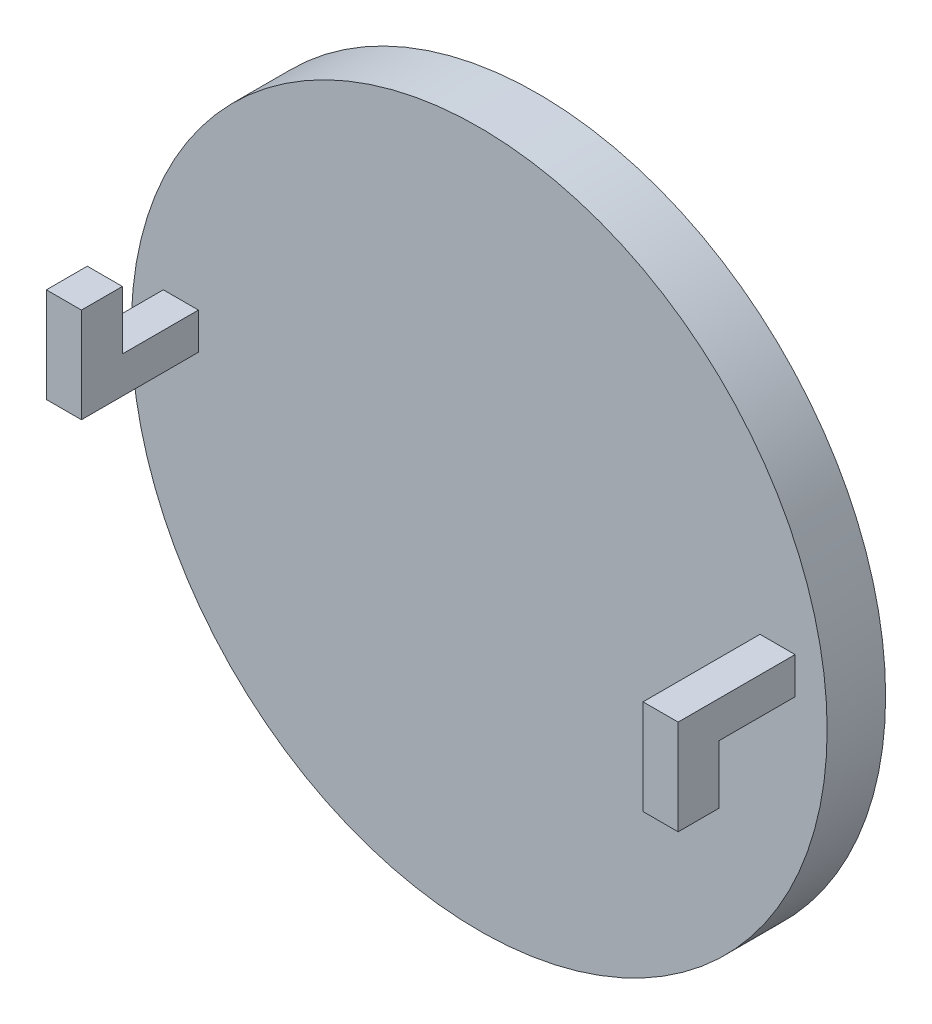
ISO-10303-21;
HEADER;
FILE_DESCRIPTION(('STEP AP214'),'2;1');
FILE_NAME('part.step','',(''),(''),'','','');
FILE_SCHEMA(('AUTOMOTIVE_DESIGN { 1 0 10303 214 1 1 1 1 }'));
ENDSEC;
DATA;
#1=APPLICATION_CONTEXT('core data for automotive mechanical design processes');
#2=APPLICATION_PROTOCOL_DEFINITION('international standard','automotive_design',2000,#1);
#3=PRODUCT_CONTEXT('',#1,'mechanical');
#4=PRODUCT('Part','Part','',(#3));
#5=PRODUCT_RELATED_PRODUCT_CATEGORY('part','',(#4));
#6=PRODUCT_DEFINITION_FORMATION('','',#4);
#7=PRODUCT_DEFINITION_CONTEXT('part definition',#1,'design');
#8=PRODUCT_DEFINITION('design','',#6,#7);
#9=PRODUCT_DEFINITION_SHAPE('','',#8);
#10=(LENGTH_UNIT() NAMED_UNIT(*) SI_UNIT(.MILLI.,.METRE.));
#11=(NAMED_UNIT(*) PLANE_ANGLE_UNIT() SI_UNIT($,.RADIAN.));
#12=(NAMED_UNIT(*) SI_UNIT($,.STERADIAN.) SOLID_ANGLE_UNIT());
#13=UNCERTAINTY_MEASURE_WITH_UNIT(LENGTH_MEASURE(1.E-05),#10,'distance_accuracy_value','');
#14=(GEOMETRIC_REPRESENTATION_CONTEXT(3) GLOBAL_UNCERTAINTY_ASSIGNED_CONTEXT((#13)) GLOBAL_UNIT_ASSIGNED_CONTEXT((#10,
#11,#12)) REPRESENTATION_CONTEXT('',''));
#15=CARTESIAN_POINT('',(0.,0.,0.));
#16=DIRECTION('',(0.,0.,1.));
#17=DIRECTION('',(1.,0.,0.));
#18=AXIS2_PLACEMENT_3D('',#15,#16,#17);
#19=CARTESIAN_POINT('',(9.60351198734748,0.431286149032511,6.));
#20=DIRECTION('',(0.,1.,0.));
#21=DIRECTION('',(0.,0.,1.));
#22=AXIS2_PLACEMENT_3D('',#19,#20,#21);
#23=PLANE('',#22);
#24=DIRECTION('',(1.,0.,0.));
#25=VECTOR('',#24,1.);
#26=CARTESIAN_POINT('',(10.8035119873475,0.431286149032511,4.6));
#27=LINE('',#26,#25);
#28=CARTESIAN_POINT('',(9.60351198734748,0.431286149032511,4.6));
#29=VERTEX_POINT('',#28);
#30=CARTESIAN_POINT('',(10.8035119873475,0.431286149032511,4.6));
#31=VERTEX_POINT('',#30);
#32=EDGE_CURVE('E161',#29,#31,#27,.T.);
#33=ORIENTED_EDGE('',*,*,#32,.F.);
#34=DIRECTION('',(0.,0.,-1.));
#35=VECTOR('',#34,1.);
#36=CARTESIAN_POINT('',(9.60351198734748,0.431286149032511,6.));
#37=LINE('',#36,#35);
#38=CARTESIAN_POINT('',(9.60351198734748,0.431286149032511,2.));
#39=VERTEX_POINT('',#38);
#40=EDGE_CURVE('E63',#29,#39,#37,.T.);
#41=ORIENTED_EDGE('',*,*,#40,.T.);
#42=DIRECTION('',(1.,0.,0.));
#43=VECTOR('',#42,1.);
#44=CARTESIAN_POINT('',(9.60351198734748,0.431286149032511,2.));
#45=LINE('',#44,#43);
#46=CARTESIAN_POINT('',(10.8035119873475,0.431286149032511,2.));
#47=VERTEX_POINT('',#46);
#48=EDGE_CURVE('E144',#39,#47,#45,.T.);
#49=ORIENTED_EDGE('',*,*,#48,.T.);
#50=DIRECTION('',(0.,0.,-1.));
#51=VECTOR('',#50,1.);
#52=CARTESIAN_POINT('',(10.8035119873475,0.431286149032511,6.));
#53=LINE('',#52,#51);
#54=EDGE_CURVE('E241',#31,#47,#53,.T.);
#55=ORIENTED_EDGE('',*,*,#54,.F.);
#56=EDGE_LOOP('',(#33,#41,#49,#55));
#57=FACE_BOUND('',#56,.T.);
#58=ADVANCED_FACE('F39',(#57),#23,.F.);
#59=CARTESIAN_POINT('',(-9.60351198734748,1.68128614903251,6.));
#60=DIRECTION('',(0.,-1.,0.));
#61=DIRECTION('',(0.,0.,-1.));
#62=AXIS2_PLACEMENT_3D('',#59,#60,#61);
#63=PLANE('',#62);
#64=DIRECTION('',(-1.,0.,0.));
#65=VECTOR('',#64,1.);
#66=CARTESIAN_POINT('',(-9.60351198734748,1.68128614903251,4.6));
#67=LINE('',#66,#65);
#68=CARTESIAN_POINT('',(-9.60351198734748,1.68128614903251,4.6));
#69=VERTEX_POINT('',#68);
#70=CARTESIAN_POINT('',(-10.8035119873475,1.68128614903251,4.6));
#71=VERTEX_POINT('',#70);
#72=EDGE_CURVE('E176',#69,#71,#67,.T.);
#73=ORIENTED_EDGE('',*,*,#72,.F.);
#74=DIRECTION('',(0.,0.,-1.));
#75=VECTOR('',#74,1.);
#76=CARTESIAN_POINT('',(-9.60351198734748,1.68128614903251,6.));
#77=LINE('',#76,#75);
#78=CARTESIAN_POINT('',(-9.60351198734748,1.68128614903251,2.));
#79=VERTEX_POINT('',#78);
#80=EDGE_CURVE('E233',#69,#79,#77,.T.);
#81=ORIENTED_EDGE('',*,*,#80,.T.);
#82=DIRECTION('',(-1.,0.,0.));
#83=VECTOR('',#82,1.);
#84=CARTESIAN_POINT('',(-9.60351198734748,1.68128614903251,2.));
#85=LINE('',#84,#83);
#86=CARTESIAN_POINT('',(-10.8035119873475,1.68128614903251,2.));
#87=VERTEX_POINT('',#86);
#88=EDGE_CURVE('E216',#79,#87,#85,.T.);
#89=ORIENTED_EDGE('',*,*,#88,.T.);
#90=DIRECTION('',(0.,0.,-1.));
#91=VECTOR('',#90,1.);
#92=CARTESIAN_POINT('',(-10.8035119873475,1.68128614903251,6.));
#93=LINE('',#92,#91);
#94=EDGE_CURVE('E230',#71,#87,#93,.T.);
#95=ORIENTED_EDGE('',*,*,#94,.F.);
#96=EDGE_LOOP('',(#73,#81,#89,#95));
#97=FACE_BOUND('',#96,.T.);
#98=ADVANCED_FACE('F279',(#97),#63,.F.);
#99=CARTESIAN_POINT('',(0.,0.,2.));
#100=DIRECTION('',(0.,0.,1.));
#101=DIRECTION('',(1.,0.,0.));
#102=AXIS2_PLACEMENT_3D('',#99,#100,#101);
#103=PLANE('',#102);
#104=CARTESIAN_POINT('',(0.,0.,2.));
#105=DIRECTION('',(0.,0.,1.));
#106=DIRECTION('',(1.,0.,0.));
#107=AXIS2_PLACEMENT_3D('',#104,#105,#106);
#108=CIRCLE('',#107,11.9);
#109=CARTESIAN_POINT('',(11.9,0.,2.));
#110=VERTEX_POINT('',#109);
#111=EDGE_CURVE('E11',#110,#110,#108,.T.);
#112=ORIENTED_EDGE('',*,*,#111,.T.);
#113=EDGE_LOOP('',(#112));
#114=FACE_BOUND('',#113,.T.);
#115=DIRECTION('',(-1.,0.,0.));
#116=VECTOR('',#115,1.);
#117=CARTESIAN_POINT('',(9.60351198734748,1.68128614903251,2.));
#118=LINE('',#117,#116);
#119=CARTESIAN_POINT('',(10.8035119873475,1.68128614903251,2.));
#120=VERTEX_POINT('',#119);
#121=CARTESIAN_POINT('',(9.60351198734748,1.68128614903251,2.));
#122=VERTEX_POINT('',#121);
#123=EDGE_CURVE('E244',#120,#122,#118,.T.);
#124=ORIENTED_EDGE('',*,*,#123,.F.);
#125=DIRECTION('',(0.,1.,0.));
#126=VECTOR('',#125,1.);
#127=CARTESIAN_POINT('',(10.8035119873475,0.431286149032511,2.));
#128=LINE('',#127,#126);
#129=EDGE_CURVE('E235',#47,#120,#128,.T.);
#130=ORIENTED_EDGE('',*,*,#129,.F.);
#131=ORIENTED_EDGE('',*,*,#48,.F.);
#132=DIRECTION('',(0.,-1.,0.));
#133=VECTOR('',#132,1.);
#134=CARTESIAN_POINT('',(9.60351198734748,0.431286149032511,2.));
#135=LINE('',#134,#133);
#136=EDGE_CURVE('E247',#122,#39,#135,.T.);
#137=ORIENTED_EDGE('',*,*,#136,.F.);
#138=EDGE_LOOP('',(#124,#130,#131,#137));
#139=FACE_BOUND('',#138,.T.);
#140=ORIENTED_EDGE('',*,*,#88,.F.);
#141=DIRECTION('',(0.,1.,0.));
#142=VECTOR('',#141,1.);
#143=CARTESIAN_POINT('',(-9.60351198734748,0.431286149032511,2.));
#144=LINE('',#143,#142);
#145=CARTESIAN_POINT('',(-9.60351198734748,0.431286149032511,2.));
#146=VERTEX_POINT('',#145);
#147=EDGE_CURVE('E201',#146,#79,#144,.T.);
#148=ORIENTED_EDGE('',*,*,#147,.F.);
#149=DIRECTION('',(1.,0.,0.));
#150=VECTOR('',#149,1.);
#151=CARTESIAN_POINT('',(-9.60351198734748,0.431286149032511,2.));
#152=LINE('',#151,#150);
#153=CARTESIAN_POINT('',(-10.8035119873475,0.431286149032511,2.));
#154=VERTEX_POINT('',#153);
#155=EDGE_CURVE('E206',#154,#146,#152,.T.);
#156=ORIENTED_EDGE('',*,*,#155,.F.);
#157=DIRECTION('',(0.,-1.,0.));
#158=VECTOR('',#157,1.);
#159=CARTESIAN_POINT('',(-10.8035119873475,0.431286149032511,2.));
#160=LINE('',#159,#158);
#161=EDGE_CURVE('E220',#87,#154,#160,.T.);
#162=ORIENTED_EDGE('',*,*,#161,.F.);
#163=EDGE_LOOP('',(#140,#148,#156,#162));
#164=FACE_BOUND('',#163,.T.);
#165=ADVANCED_FACE('F275',(#114,#139,#164),#103,.T.);
#166=CARTESIAN_POINT('',(0.,0.,2.));
#167=DIRECTION('',(0.,0.,-1.));
#168=DIRECTION('',(-1.,0.,0.));
#169=AXIS2_PLACEMENT_3D('',#166,#167,#168);
#170=CYLINDRICAL_SURFACE('',#169,11.9);
#171=ORIENTED_EDGE('',*,*,#111,.F.);
#172=EDGE_LOOP('',(#171));
#173=FACE_BOUND('',#172,.T.);
#174=CARTESIAN_POINT('',(0.,0.,0.));
#175=DIRECTION('',(0.,0.,1.));
#176=DIRECTION('',(1.,0.,0.));
#177=AXIS2_PLACEMENT_3D('',#174,#175,#176);
#178=CIRCLE('',#177,11.9);
#179=CARTESIAN_POINT('',(11.9,0.,0.));
#180=VERTEX_POINT('',#179);
#181=EDGE_CURVE('E43',#180,#180,#178,.T.);
#182=ORIENTED_EDGE('',*,*,#181,.T.);
#183=EDGE_LOOP('',(#182));
#184=FACE_BOUND('',#183,.T.);
#185=ADVANCED_FACE('F41',(#173,#184),#170,.T.);
#186=CARTESIAN_POINT('',(0.,0.,0.));
#187=DIRECTION('',(0.,0.,1.));
#188=DIRECTION('',(1.,0.,0.));
#189=AXIS2_PLACEMENT_3D('',#186,#187,#188);
#190=PLANE('',#189);
#191=ORIENTED_EDGE('',*,*,#181,.F.);
#192=EDGE_LOOP('',(#191));
#193=FACE_BOUND('',#192,.T.);
#194=ADVANCED_FACE('F267',(#193),#190,.F.);
#195=CARTESIAN_POINT('',(10.8035119873475,0.431286149032511,6.));
#196=DIRECTION('',(-1.,0.,0.));
#197=DIRECTION('',(0.,0.,1.));
#198=AXIS2_PLACEMENT_3D('',#195,#196,#197);
#199=PLANE('',#198);
#200=ORIENTED_EDGE('',*,*,#129,.T.);
#201=DIRECTION('',(0.,0.,-1.));
#202=VECTOR('',#201,1.);
#203=CARTESIAN_POINT('',(10.8035119873475,1.68128614903251,6.));
#204=LINE('',#203,#202);
#205=CARTESIAN_POINT('',(10.8035119873475,1.68128614903251,6.));
#206=VERTEX_POINT('',#205);
#207=EDGE_CURVE('E140',#206,#120,#204,.T.);
#208=ORIENTED_EDGE('',*,*,#207,.F.);
#209=DIRECTION('',(0.,1.,0.));
#210=VECTOR('',#209,1.);
#211=CARTESIAN_POINT('',(10.8035119873475,0.431286149032511,6.));
#212=LINE('',#211,#210);
#213=CARTESIAN_POINT('',(10.8035119873475,-1.56871385096749,6.));
#214=VERTEX_POINT('',#213);
#215=EDGE_CURVE('E133',#214,#206,#212,.T.);
#216=ORIENTED_EDGE('',*,*,#215,.F.);
#217=DIRECTION('',(0.,0.,1.));
#218=VECTOR('',#217,1.);
#219=CARTESIAN_POINT('',(10.8035119873475,-1.56871385096749,6.));
#220=LINE('',#219,#218);
#221=CARTESIAN_POINT('',(10.8035119873475,-1.56871385096749,4.6));
#222=VERTEX_POINT('',#221);
#223=EDGE_CURVE('E139',#222,#214,#220,.T.);
#224=ORIENTED_EDGE('',*,*,#223,.F.);
#225=DIRECTION('',(0.,1.,0.));
#226=VECTOR('',#225,1.);
#227=CARTESIAN_POINT('',(10.8035119873475,-1.56871385096749,4.6));
#228=LINE('',#227,#226);
#229=EDGE_CURVE('E169',#222,#31,#228,.T.);
#230=ORIENTED_EDGE('',*,*,#229,.T.);
#231=ORIENTED_EDGE('',*,*,#54,.T.);
#232=EDGE_LOOP('',(#200,#208,#216,#224,#230,#231));
#233=FACE_BOUND('',#232,.T.);
#234=ADVANCED_FACE('F136',(#233),#199,.F.);
#235=CARTESIAN_POINT('',(9.60351198734748,1.68128614903251,6.));
#236=DIRECTION('',(0.,-1.,0.));
#237=DIRECTION('',(0.,0.,-1.));
#238=AXIS2_PLACEMENT_3D('',#235,#236,#237);
#239=PLANE('',#238);
#240=ORIENTED_EDGE('',*,*,#123,.T.);
#241=DIRECTION('',(0.,0.,-1.));
#242=VECTOR('',#241,1.);
#243=CARTESIAN_POINT('',(9.60351198734748,1.68128614903251,6.));
#244=LINE('',#243,#242);
#245=CARTESIAN_POINT('',(9.60351198734748,1.68128614903251,6.));
#246=VERTEX_POINT('',#245);
#247=EDGE_CURVE('E256',#246,#122,#244,.T.);
#248=ORIENTED_EDGE('',*,*,#247,.F.);
#249=DIRECTION('',(-1.,0.,0.));
#250=VECTOR('',#249,1.);
#251=CARTESIAN_POINT('',(9.60351198734748,1.68128614903251,6.));
#252=LINE('',#251,#250);
#253=EDGE_CURVE('E143',#206,#246,#252,.T.);
#254=ORIENTED_EDGE('',*,*,#253,.F.);
#255=ORIENTED_EDGE('',*,*,#207,.T.);
#256=EDGE_LOOP('',(#240,#248,#254,#255));
#257=FACE_BOUND('',#256,.T.);
#258=ADVANCED_FACE('F273',(#257),#239,.F.);
#259=CARTESIAN_POINT('',(9.60351198734748,0.431286149032511,6.));
#260=DIRECTION('',(1.,0.,0.));
#261=DIRECTION('',(0.,0.,-1.));
#262=AXIS2_PLACEMENT_3D('',#259,#260,#261);
#263=PLANE('',#262);
#264=ORIENTED_EDGE('',*,*,#136,.T.);
#265=ORIENTED_EDGE('',*,*,#40,.F.);
#266=DIRECTION('',(0.,1.,0.));
#267=VECTOR('',#266,1.);
#268=CARTESIAN_POINT('',(9.60351198734748,-1.56871385096749,4.6));
#269=LINE('',#268,#267);
#270=CARTESIAN_POINT('',(9.60351198734748,-1.56871385096749,4.6));
#271=VERTEX_POINT('',#270);
#272=EDGE_CURVE('E173',#271,#29,#269,.T.);
#273=ORIENTED_EDGE('',*,*,#272,.F.);
#274=DIRECTION('',(0.,0.,-1.));
#275=VECTOR('',#274,1.);
#276=CARTESIAN_POINT('',(9.60351198734748,-1.56871385096749,6.));
#277=LINE('',#276,#275);
#278=CARTESIAN_POINT('',(9.60351198734748,-1.56871385096749,6.));
#279=VERTEX_POINT('',#278);
#280=EDGE_CURVE('E154',#279,#271,#277,.T.);
#281=ORIENTED_EDGE('',*,*,#280,.F.);
#282=DIRECTION('',(0.,-1.,0.));
#283=VECTOR('',#282,1.);
#284=CARTESIAN_POINT('',(9.60351198734748,0.431286149032511,6.));
#285=LINE('',#284,#283);
#286=EDGE_CURVE('E150',#246,#279,#285,.T.);
#287=ORIENTED_EDGE('',*,*,#286,.F.);
#288=ORIENTED_EDGE('',*,*,#247,.T.);
#289=EDGE_LOOP('',(#264,#265,#273,#281,#287,#288));
#290=FACE_BOUND('',#289,.T.);
#291=ADVANCED_FACE('F289',(#290),#263,.F.);
#292=CARTESIAN_POINT('',(0.,0.,6.));
#293=DIRECTION('',(0.,0.,-1.));
#294=DIRECTION('',(-1.,0.,0.));
#295=AXIS2_PLACEMENT_3D('',#292,#293,#294);
#296=PLANE('',#295);
#297=ORIENTED_EDGE('',*,*,#215,.T.);
#298=ORIENTED_EDGE('',*,*,#253,.T.);
#299=ORIENTED_EDGE('',*,*,#286,.T.);
#300=DIRECTION('',(-1.,0.,0.));
#301=VECTOR('',#300,1.);
#302=CARTESIAN_POINT('',(10.8035119873475,-1.56871385096749,6.));
#303=LINE('',#302,#301);
#304=EDGE_CURVE('E147',#214,#279,#303,.T.);
#305=ORIENTED_EDGE('',*,*,#304,.F.);
#306=EDGE_LOOP('',(#297,#298,#299,#305));
#307=FACE_BOUND('',#306,.T.);
#308=ADVANCED_FACE('F148',(#307),#296,.F.);
#309=CARTESIAN_POINT('',(-9.60351198734748,0.431286149032511,6.));
#310=DIRECTION('',(-1.,0.,0.));
#311=DIRECTION('',(0.,0.,1.));
#312=AXIS2_PLACEMENT_3D('',#309,#310,#311);
#313=PLANE('',#312);
#314=ORIENTED_EDGE('',*,*,#147,.T.);
#315=ORIENTED_EDGE('',*,*,#80,.F.);
#316=DIRECTION('',(0.,-1.,0.));
#317=VECTOR('',#316,1.);
#318=CARTESIAN_POINT('',(-9.60351198734748,3.68128614903251,4.6));
#319=LINE('',#318,#317);
#320=CARTESIAN_POINT('',(-9.60351198734748,3.68128614903251,4.6));
#321=VERTEX_POINT('',#320);
#322=EDGE_CURVE('E198',#321,#69,#319,.T.);
#323=ORIENTED_EDGE('',*,*,#322,.F.);
#324=DIRECTION('',(0.,0.,-1.));
#325=VECTOR('',#324,1.);
#326=CARTESIAN_POINT('',(-9.60351198734748,3.68128614903251,6.));
#327=LINE('',#326,#325);
#328=CARTESIAN_POINT('',(-9.60351198734748,3.68128614903251,6.));
#329=VERTEX_POINT('',#328);
#330=EDGE_CURVE('E177',#329,#321,#327,.T.);
#331=ORIENTED_EDGE('',*,*,#330,.F.);
#332=DIRECTION('',(0.,1.,0.));
#333=VECTOR('',#332,1.);
#334=CARTESIAN_POINT('',(-9.60351198734748,0.431286149032511,6.));
#335=LINE('',#334,#333);
#336=CARTESIAN_POINT('',(-9.60351198734748,0.431286149032511,6.));
#337=VERTEX_POINT('',#336);
#338=EDGE_CURVE('E202',#337,#329,#335,.T.);
#339=ORIENTED_EDGE('',*,*,#338,.F.);
#340=DIRECTION('',(0.,0.,-1.));
#341=VECTOR('',#340,1.);
#342=CARTESIAN_POINT('',(-9.60351198734748,0.431286149032511,6.));
#343=LINE('',#342,#341);
#344=EDGE_CURVE('E212',#337,#146,#343,.T.);
#345=ORIENTED_EDGE('',*,*,#344,.T.);
#346=EDGE_LOOP('',(#314,#315,#323,#331,#339,#345));
#347=FACE_BOUND('',#346,.T.);
#348=ADVANCED_FACE('F313',(#347),#313,.F.);
#349=CARTESIAN_POINT('',(-10.8035119873475,0.431286149032511,6.));
#350=DIRECTION('',(1.,0.,0.));
#351=DIRECTION('',(0.,0.,-1.));
#352=AXIS2_PLACEMENT_3D('',#349,#350,#351);
#353=PLANE('',#352);
#354=ORIENTED_EDGE('',*,*,#161,.T.);
#355=DIRECTION('',(0.,0.,-1.));
#356=VECTOR('',#355,1.);
#357=CARTESIAN_POINT('',(-10.8035119873475,0.431286149032511,6.));
#358=LINE('',#357,#356);
#359=CARTESIAN_POINT('',(-10.8035119873475,0.431286149032511,6.));
#360=VERTEX_POINT('',#359);
#361=EDGE_CURVE('E55',#360,#154,#358,.T.);
#362=ORIENTED_EDGE('',*,*,#361,.F.);
#363=DIRECTION('',(0.,-1.,0.));
#364=VECTOR('',#363,1.);
#365=CARTESIAN_POINT('',(-10.8035119873475,0.431286149032511,6.));
#366=LINE('',#365,#364);
#367=CARTESIAN_POINT('',(-10.8035119873475,3.68128614903251,6.));
#368=VERTEX_POINT('',#367);
#369=EDGE_CURVE('E205',#368,#360,#366,.T.);
#370=ORIENTED_EDGE('',*,*,#369,.F.);
#371=DIRECTION('',(0.,0.,1.));
#372=VECTOR('',#371,1.);
#373=CARTESIAN_POINT('',(-10.8035119873475,3.68128614903251,6.));
#374=LINE('',#373,#372);
#375=CARTESIAN_POINT('',(-10.8035119873475,3.68128614903251,4.6));
#376=VERTEX_POINT('',#375);
#377=EDGE_CURVE('E184',#376,#368,#374,.T.);
#378=ORIENTED_EDGE('',*,*,#377,.F.);
#379=DIRECTION('',(0.,-1.,0.));
#380=VECTOR('',#379,1.);
#381=CARTESIAN_POINT('',(-10.8035119873475,3.68128614903251,4.6));
#382=LINE('',#381,#380);
#383=EDGE_CURVE('E192',#376,#71,#382,.T.);
#384=ORIENTED_EDGE('',*,*,#383,.T.);
#385=ORIENTED_EDGE('',*,*,#94,.T.);
#386=EDGE_LOOP('',(#354,#362,#370,#378,#384,#385));
#387=FACE_BOUND('',#386,.T.);
#388=ADVANCED_FACE('F323',(#387),#353,.F.);
#389=CARTESIAN_POINT('',(-9.60351198734748,0.431286149032511,6.));
#390=DIRECTION('',(0.,1.,0.));
#391=DIRECTION('',(0.,0.,1.));
#392=AXIS2_PLACEMENT_3D('',#389,#390,#391);
#393=PLANE('',#392);
#394=ORIENTED_EDGE('',*,*,#155,.T.);
#395=ORIENTED_EDGE('',*,*,#344,.F.);
#396=DIRECTION('',(1.,0.,0.));
#397=VECTOR('',#396,1.);
#398=CARTESIAN_POINT('',(-9.60351198734748,0.431286149032511,6.));
#399=LINE('',#398,#397);
#400=EDGE_CURVE('E209',#360,#337,#399,.T.);
#401=ORIENTED_EDGE('',*,*,#400,.F.);
#402=ORIENTED_EDGE('',*,*,#361,.T.);
#403=EDGE_LOOP('',(#394,#395,#401,#402));
#404=FACE_BOUND('',#403,.T.);
#405=ADVANCED_FACE('F317',(#404),#393,.F.);
#406=CARTESIAN_POINT('',(0.,0.,6.));
#407=DIRECTION('',(0.,0.,1.));
#408=DIRECTION('',(1.,0.,0.));
#409=AXIS2_PLACEMENT_3D('',#406,#407,#408);
#410=PLANE('',#409);
#411=ORIENTED_EDGE('',*,*,#338,.T.);
#412=DIRECTION('',(1.,0.,0.));
#413=VECTOR('',#412,1.);
#414=CARTESIAN_POINT('',(-9.60351198734748,3.68128614903251,6.));
#415=LINE('',#414,#413);
#416=EDGE_CURVE('E188',#368,#329,#415,.T.);
#417=ORIENTED_EDGE('',*,*,#416,.F.);
#418=ORIENTED_EDGE('',*,*,#369,.T.);
#419=ORIENTED_EDGE('',*,*,#400,.T.);
#420=EDGE_LOOP('',(#411,#417,#418,#419));
#421=FACE_BOUND('',#420,.T.);
#422=ADVANCED_FACE('F319',(#421),#410,.T.);
#423=CARTESIAN_POINT('',(-9.60351198734748,3.68128614903251,4.6));
#424=DIRECTION('',(0.,0.,1.));
#425=DIRECTION('',(1.,0.,0.));
#426=AXIS2_PLACEMENT_3D('',#423,#424,#425);
#427=PLANE('',#426);
#428=ORIENTED_EDGE('',*,*,#72,.T.);
#429=ORIENTED_EDGE('',*,*,#383,.F.);
#430=DIRECTION('',(-1.,0.,0.));
#431=VECTOR('',#430,1.);
#432=CARTESIAN_POINT('',(-9.60351198734748,3.68128614903251,4.6));
#433=LINE('',#432,#431);
#434=EDGE_CURVE('E181',#321,#376,#433,.T.);
#435=ORIENTED_EDGE('',*,*,#434,.F.);
#436=ORIENTED_EDGE('',*,*,#322,.T.);
#437=EDGE_LOOP('',(#428,#429,#435,#436));
#438=FACE_BOUND('',#437,.T.);
#439=ADVANCED_FACE('F326',(#438),#427,.F.);
#440=CARTESIAN_POINT('',(0.,3.68128614903251,0.));
#441=DIRECTION('',(0.,1.,0.));
#442=DIRECTION('',(0.,0.,1.));
#443=AXIS2_PLACEMENT_3D('',#440,#441,#442);
#444=PLANE('',#443);
#445=ORIENTED_EDGE('',*,*,#330,.T.);
#446=ORIENTED_EDGE('',*,*,#434,.T.);
#447=ORIENTED_EDGE('',*,*,#377,.T.);
#448=ORIENTED_EDGE('',*,*,#416,.T.);
#449=EDGE_LOOP('',(#445,#446,#447,#448));
#450=FACE_BOUND('',#449,.T.);
#451=ADVANCED_FACE('F328',(#450),#444,.T.);
#452=CARTESIAN_POINT('',(10.8035119873475,-1.56871385096749,4.6));
#453=DIRECTION('',(0.,0.,1.));
#454=DIRECTION('',(1.,0.,0.));
#455=AXIS2_PLACEMENT_3D('',#452,#453,#454);
#456=PLANE('',#455);
#457=ORIENTED_EDGE('',*,*,#32,.T.);
#458=ORIENTED_EDGE('',*,*,#229,.F.);
#459=DIRECTION('',(1.,0.,0.));
#460=VECTOR('',#459,1.);
#461=CARTESIAN_POINT('',(10.8035119873475,-1.56871385096749,4.6));
#462=LINE('',#461,#460);
#463=EDGE_CURVE('E158',#271,#222,#462,.T.);
#464=ORIENTED_EDGE('',*,*,#463,.F.);
#465=ORIENTED_EDGE('',*,*,#272,.T.);
#466=EDGE_LOOP('',(#457,#458,#464,#465));
#467=FACE_BOUND('',#466,.T.);
#468=ADVANCED_FACE('F330',(#467),#456,.F.);
#469=CARTESIAN_POINT('',(0.,-1.56871385096749,0.));
#470=DIRECTION('',(0.,1.,0.));
#471=DIRECTION('',(0.,0.,1.));
#472=AXIS2_PLACEMENT_3D('',#469,#470,#471);
#473=PLANE('',#472);
#474=ORIENTED_EDGE('',*,*,#223,.T.);
#475=ORIENTED_EDGE('',*,*,#304,.T.);
#476=ORIENTED_EDGE('',*,*,#280,.T.);
#477=ORIENTED_EDGE('',*,*,#463,.T.);
#478=EDGE_LOOP('',(#474,#475,#476,#477));
#479=FACE_BOUND('',#478,.T.);
#480=ADVANCED_FACE('F156',(#479),#473,.F.);
#481=CLOSED_SHELL('',(#58,#98,#165,#185,#194,#234,#258,#291,#308,#348,#388,#405,#422,#439,#451,
#468,#480));
#482=MANIFOLD_SOLID_BREP('B2',#481);
#483=ADVANCED_BREP_SHAPE_REPRESENTATION('',(#18,#482),#14);
#484=SHAPE_DEFINITION_REPRESENTATION(#9,#483);
ENDSEC;
END-ISO-10303-21;
